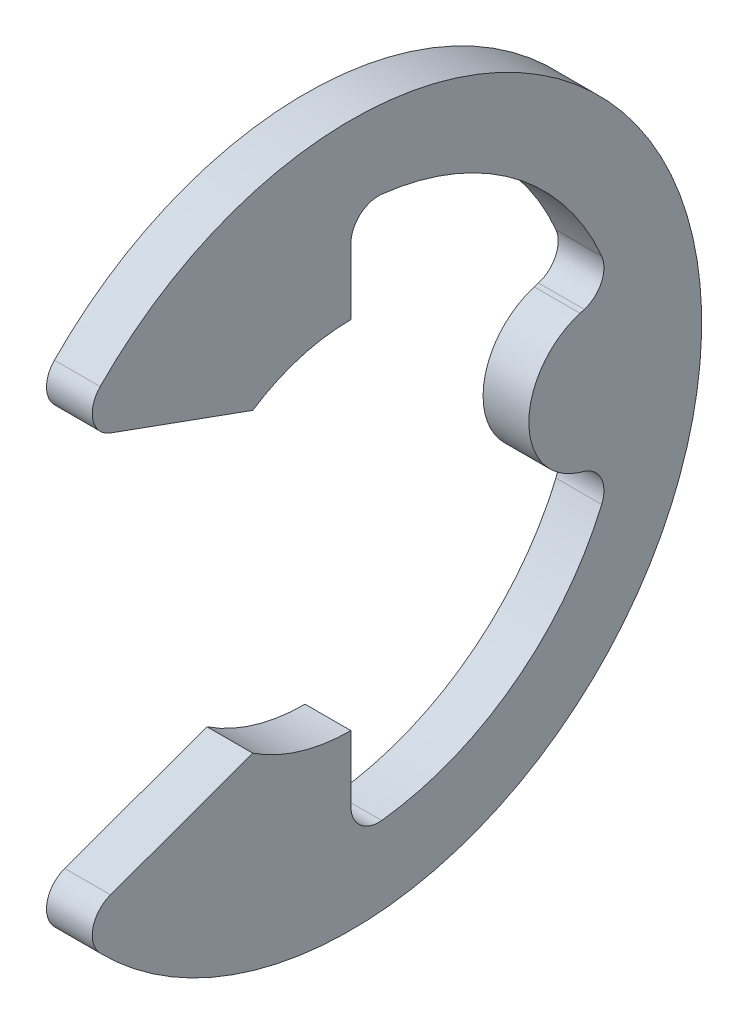
ISO-10303-21;
HEADER;
FILE_DESCRIPTION(('STEP AP214'),'2;1');
FILE_NAME('part.step','',(''),(''),'','','');
FILE_SCHEMA(('AUTOMOTIVE_DESIGN { 1 0 10303 214 1 1 1 1 }'));
ENDSEC;
DATA;
#1=APPLICATION_CONTEXT('core data for automotive mechanical design processes');
#2=APPLICATION_PROTOCOL_DEFINITION('international standard','automotive_design',2000,#1);
#3=PRODUCT_CONTEXT('',#1,'mechanical');
#4=PRODUCT('Part','Part','',(#3));
#5=PRODUCT_RELATED_PRODUCT_CATEGORY('part','',(#4));
#6=PRODUCT_DEFINITION_FORMATION('','',#4);
#7=PRODUCT_DEFINITION_CONTEXT('part definition',#1,'design');
#8=PRODUCT_DEFINITION('design','',#6,#7);
#9=PRODUCT_DEFINITION_SHAPE('','',#8);
#10=(LENGTH_UNIT() NAMED_UNIT(*) SI_UNIT(.MILLI.,.METRE.));
#11=(NAMED_UNIT(*) PLANE_ANGLE_UNIT() SI_UNIT($,.RADIAN.));
#12=(NAMED_UNIT(*) SI_UNIT($,.STERADIAN.) SOLID_ANGLE_UNIT());
#13=UNCERTAINTY_MEASURE_WITH_UNIT(LENGTH_MEASURE(1.E-05),#10,'distance_accuracy_value','');
#14=(GEOMETRIC_REPRESENTATION_CONTEXT(3) GLOBAL_UNCERTAINTY_ASSIGNED_CONTEXT((#13)) GLOBAL_UNIT_ASSIGNED_CONTEXT((#10,
#11,#12)) REPRESENTATION_CONTEXT('',''));
#15=CARTESIAN_POINT('',(0.,0.,0.));
#16=DIRECTION('',(0.,0.,1.));
#17=DIRECTION('',(1.,0.,0.));
#18=AXIS2_PLACEMENT_3D('',#15,#16,#17);
#19=CARTESIAN_POINT('',(0.432,-1.0838507650733,-3.8504669068883));
#20=CARTESIAN_POINT('',(0.408000000000001,-1.0838507650733,-3.8504669068883));
#21=CARTESIAN_POINT('',(0.383999999999999,-1.0838507650733,-3.8504669068883));
#22=CARTESIAN_POINT('',(0.120000000000007,-1.0838507650733,-3.8504669068883));
#23=CARTESIAN_POINT('',(-0.119999999999997,-1.0838507650733,-3.8504669068883));
#24=CARTESIAN_POINT('',(-0.384,-1.0838507650733,-3.8504669068883));
#25=CARTESIAN_POINT('',(-0.407999999999999,-1.0838507650733,-3.8504669068883));
#26=CARTESIAN_POINT('',(-0.432,-1.0838507650733,-3.8504669068883));
#27=CARTESIAN_POINT('',(0.432,-0.687854206099396,-2.53298418194946));
#28=CARTESIAN_POINT('',(0.408000000000001,-0.687854206099396,-2.53298418194946));
#29=CARTESIAN_POINT('',(0.383999999999999,-0.687854206099396,-2.53298418194946));
#30=CARTESIAN_POINT('',(0.120000000000007,-0.687854206099396,-2.53298418194946));
#31=CARTESIAN_POINT('',(-0.120000000000003,-0.687854206099396,-2.53298418194946));
#32=CARTESIAN_POINT('',(-0.384,-0.687854206099396,-2.53298418194946));
#33=CARTESIAN_POINT('',(-0.408,-0.687854206099396,-2.53298418194946));
#34=CARTESIAN_POINT('',(-0.432,-0.687854206099396,-2.53298418194946));
#35=CARTESIAN_POINT('',(0.432,0.687854340516284,-2.53298418194946));
#36=CARTESIAN_POINT('',(0.408000000000001,0.687854340516284,-2.53298418194946));
#37=CARTESIAN_POINT('',(0.383999999999999,0.687854340516284,-2.53298418194946));
#38=CARTESIAN_POINT('',(0.120000000000007,0.687854340516284,-2.53298418194946));
#39=CARTESIAN_POINT('',(-0.120000000000003,0.687854340516284,-2.53298418194946));
#40=CARTESIAN_POINT('',(-0.384,0.687854340516284,-2.53298418194946));
#41=CARTESIAN_POINT('',(-0.408,0.687854340516284,-2.53298418194946));
#42=CARTESIAN_POINT('',(-0.432,0.687854340516284,-2.53298418194946));
#43=CARTESIAN_POINT('',(0.432,1.08385089949019,-3.8504669068883));
#44=CARTESIAN_POINT('',(0.408000000000001,1.08385089949019,-3.8504669068883));
#45=CARTESIAN_POINT('',(0.383999999999999,1.08385089949019,-3.8504669068883));
#46=CARTESIAN_POINT('',(0.120000000000007,1.08385089949019,-3.8504669068883));
#47=CARTESIAN_POINT('',(-0.12000000000001,1.08385089949019,-3.8504669068883));
#48=CARTESIAN_POINT('',(-0.383999999999999,1.08385089949019,-3.8504669068883));
#49=CARTESIAN_POINT('',(-0.408,1.08385089949019,-3.8504669068883));
#50=CARTESIAN_POINT('',(-0.432,1.08385089949019,-3.8504669068883));
#51=(BOUNDED_SURFACE() B_SPLINE_SURFACE(3,3,((#19,#20,#21,#22,#23,#24,#25,#26),(#27,#28,#29,#30,
#31,#32,#33,#34),(#35,#36,#37,#38,#39,#40,#41,#42),(#43,#44,#45,#46,#47,#48,#49,#50)),
.UNSPECIFIED.,.F.,.F.,.F.) B_SPLINE_SURFACE_WITH_KNOTS((4,4),(4,2,2,4),(0.,1.),(-0.1,0.,1.,1.1),
.UNSPECIFIED.) GEOMETRIC_REPRESENTATION_ITEM() RATIONAL_B_SPLINE_SURFACE(((1.,1.,1.,1.,1.,1.,1.,
1.),(0.525232777901046,0.525232777901046,0.525232777901047,0.525232777901047,0.525232777901047,
0.525232777901047,0.525232777901046,0.525232777901046),(0.525232777901046,0.525232777901046,
0.525232777901047,0.525232777901047,0.525232777901047,0.525232777901047,0.525232777901046,
0.525232777901046),(1.,1.,1.,1.,1.,1.,1.,1.))) REPRESENTATION_ITEM('') SURFACE());
#52=CARTESIAN_POINT('',(0.432,1.08385089949019,-3.8504669068883));
#53=CARTESIAN_POINT('',(0.408000000000001,1.08385089949019,-3.8504669068883));
#54=CARTESIAN_POINT('',(0.383999999999999,1.08385089949019,-3.8504669068883));
#55=CARTESIAN_POINT('',(0.120000000000007,1.08385089949019,-3.8504669068883));
#56=CARTESIAN_POINT('',(-0.12000000000001,1.08385089949019,-3.8504669068883));
#57=CARTESIAN_POINT('',(-0.383999999999999,1.08385089949019,-3.8504669068883));
#58=CARTESIAN_POINT('',(-0.408,1.08385089949019,-3.8504669068883));
#59=CARTESIAN_POINT('',(-0.432,1.08385089949019,-3.8504669068883));
#60=(BOUNDED_CURVE() B_SPLINE_CURVE(3,(#52,#53,#54,#55,#56,#57,#58,#59),.UNSPECIFIED.,.F.,
.F.) B_SPLINE_CURVE_WITH_KNOTS((4,2,2,4),(-0.1,0.,1.,1.1),
.UNSPECIFIED.) CURVE() GEOMETRIC_REPRESENTATION_ITEM() RATIONAL_B_SPLINE_CURVE((1.,1.,1.,1.,1.,
1.,1.,1.)) REPRESENTATION_ITEM(''));
#61=CARTESIAN_POINT('',(-0.36,1.08385089949019,-3.8504669068883));
#62=VERTEX_POINT('',#61);
#63=CARTESIAN_POINT('',(0.36,1.08385089949019,-3.8504669068883));
#64=VERTEX_POINT('',#63);
#65=EDGE_CURVE('E198',#62,#64,#60,.F.);
#66=CARTESIAN_POINT('',(-0.36,1.08385089949019,-3.8504669068883));
#67=CARTESIAN_POINT('',(-0.36,0.687854340516284,-2.53298418194946));
#68=CARTESIAN_POINT('',(-0.36,-0.687854206099396,-2.53298418194946));
#69=CARTESIAN_POINT('',(-0.36,-1.0838507650733,-3.8504669068883));
#70=(BOUNDED_CURVE() B_SPLINE_CURVE(3,(#66,#67,#68,#69),.UNSPECIFIED.,.F.,
.F.) B_SPLINE_CURVE_WITH_KNOTS((4,4),(0.,1.),
.UNSPECIFIED.) CURVE() GEOMETRIC_REPRESENTATION_ITEM() RATIONAL_B_SPLINE_CURVE((1.,
0.525232777901047,0.525232777901047,1.)) REPRESENTATION_ITEM(''));
#71=CARTESIAN_POINT('',(-0.36,-1.0838507650733,-3.8504669068883));
#72=VERTEX_POINT('',#71);
#73=EDGE_CURVE('E460',#72,#62,#70,.F.);
#74=CARTESIAN_POINT('',(-0.432,-1.0838507650733,-3.8504669068883));
#75=CARTESIAN_POINT('',(-0.407999999999999,-1.0838507650733,-3.8504669068883));
#76=CARTESIAN_POINT('',(-0.384,-1.0838507650733,-3.8504669068883));
#77=CARTESIAN_POINT('',(-0.119999999999997,-1.0838507650733,-3.8504669068883));
#78=CARTESIAN_POINT('',(0.120000000000007,-1.0838507650733,-3.8504669068883));
#79=CARTESIAN_POINT('',(0.383999999999999,-1.0838507650733,-3.8504669068883));
#80=CARTESIAN_POINT('',(0.408000000000001,-1.0838507650733,-3.8504669068883));
#81=CARTESIAN_POINT('',(0.432,-1.0838507650733,-3.8504669068883));
#82=(BOUNDED_CURVE() B_SPLINE_CURVE(3,(#74,#75,#76,#77,#78,#79,#80,#81),.UNSPECIFIED.,.F.,
.F.) B_SPLINE_CURVE_WITH_KNOTS((4,2,2,4),(-0.1,0.,1.,1.1),
.UNSPECIFIED.) CURVE() GEOMETRIC_REPRESENTATION_ITEM() RATIONAL_B_SPLINE_CURVE((1.,1.,1.,1.,1.,
1.,1.,1.)) REPRESENTATION_ITEM(''));
#83=CARTESIAN_POINT('',(0.36,-1.0838507650733,-3.8504669068883));
#84=VERTEX_POINT('',#83);
#85=EDGE_CURVE('E331',#84,#72,#82,.F.);
#86=CARTESIAN_POINT('',(0.36,-1.0838507650733,-3.8504669068883));
#87=CARTESIAN_POINT('',(0.36,-0.687854206099396,-2.53298418194946));
#88=CARTESIAN_POINT('',(0.36,0.687854340516284,-2.53298418194946));
#89=CARTESIAN_POINT('',(0.36,1.08385089949019,-3.8504669068883));
#90=(BOUNDED_CURVE() B_SPLINE_CURVE(3,(#86,#87,#88,#89),.UNSPECIFIED.,.F.,
.F.) B_SPLINE_CURVE_WITH_KNOTS((4,4),(0.,1.),
.UNSPECIFIED.) CURVE() GEOMETRIC_REPRESENTATION_ITEM() RATIONAL_B_SPLINE_CURVE((1.,
0.525232777901047,0.525232777901047,1.)) REPRESENTATION_ITEM(''));
#91=EDGE_CURVE('E405',#64,#84,#90,.F.);
#92=ORIENTED_EDGE('',*,*,#65,.F.);
#93=ORIENTED_EDGE('',*,*,#73,.F.);
#94=ORIENTED_EDGE('',*,*,#85,.F.);
#95=ORIENTED_EDGE('',*,*,#91,.F.);
#96=EDGE_LOOP('',(#92,#93,#94,#95));
#97=FACE_BOUND('',#96,.T.);
#98=ADVANCED_FACE('F51',(#97),#51,.T.);
#99=CARTESIAN_POINT('',(0.36,6.72084442246652E-08,-0.244489239703902));
#100=DIRECTION('',(-1.,0.,0.));
#101=DIRECTION('',(0.,0.,1.));
#102=AXIS2_PLACEMENT_3D('',#99,#100,#101);
#103=CYLINDRICAL_SURFACE('',#102,5.52);
#104=CARTESIAN_POINT('',(0.36,6.72084442246652E-08,-0.244489239703902));
#105=DIRECTION('',(1.,0.,0.));
#106=DIRECTION('',(0.,0.,-1.));
#107=AXIS2_PLACEMENT_3D('',#104,#105,#106);
#108=CIRCLE('',#107,5.52);
#109=CARTESIAN_POINT('',(0.36,-3.86033621487492,3.70116707949457));
#110=VERTEX_POINT('',#109);
#111=CARTESIAN_POINT('',(0.36,3.86033634929181,3.70116707949457));
#112=VERTEX_POINT('',#111);
#113=EDGE_CURVE('E188',#110,#112,#108,.T.);
#114=ORIENTED_EDGE('',*,*,#113,.F.);
#115=DIRECTION('',(-1.,0.,0.));
#116=VECTOR('',#115,1.);
#117=CARTESIAN_POINT('',(0.36,-3.86033621487492,3.70116707949457));
#118=LINE('',#117,#116);
#119=CARTESIAN_POINT('',(-0.36,-3.86033621487492,3.70116707949457));
#120=VERTEX_POINT('',#119);
#121=EDGE_CURVE('E301',#110,#120,#118,.T.);
#122=ORIENTED_EDGE('',*,*,#121,.T.);
#123=CARTESIAN_POINT('',(-0.36,6.72084442246652E-08,-0.244489239703902));
#124=DIRECTION('',(1.,0.,0.));
#125=DIRECTION('',(0.,0.,-1.));
#126=AXIS2_PLACEMENT_3D('',#123,#124,#125);
#127=CIRCLE('',#126,5.52);
#128=CARTESIAN_POINT('',(-0.36,3.86033634929181,3.70116707949457));
#129=VERTEX_POINT('',#128);
#130=EDGE_CURVE('E495',#120,#129,#127,.T.);
#131=ORIENTED_EDGE('',*,*,#130,.T.);
#132=DIRECTION('',(-1.,0.,0.));
#133=VECTOR('',#132,1.);
#134=CARTESIAN_POINT('',(0.36,3.86033634929181,3.70116707949457));
#135=LINE('',#134,#133);
#136=EDGE_CURVE('E298',#129,#112,#135,.F.);
#137=ORIENTED_EDGE('',*,*,#136,.T.);
#138=EDGE_LOOP('',(#114,#122,#131,#137));
#139=FACE_BOUND('',#138,.T.);
#140=ADVANCED_FACE('F364',(#139),#103,.T.);
#141=CARTESIAN_POINT('',(0.36,3.36227775508424,4.13335140947608));
#142=DIRECTION('',(0.,0.940251578674077,-0.340480496946456));
#143=DIRECTION('',(0.,0.340480496946456,0.940251578674077));
#144=AXIS2_PLACEMENT_3D('',#141,#142,#143);
#145=PLANE('',#144);
#146=DIRECTION('',(0.,-0.340480496946456,-0.940251578674077));
#147=VECTOR('',#146,1.);
#148=CARTESIAN_POINT('',(0.36,3.36227775508424,4.13335140947608));
#149=LINE('',#148,#147);
#150=CARTESIAN_POINT('',(0.36,3.14678771189729,3.53826636022306));
#151=VERTEX_POINT('',#150);
#152=CARTESIAN_POINT('',(0.36,2.33600006720844,1.29924130673223));
#153=VERTEX_POINT('',#152);
#154=EDGE_CURVE('E176',#151,#153,#149,.T.);
#155=ORIENTED_EDGE('',*,*,#154,.F.);
#156=DIRECTION('',(-1.,0.,0.));
#157=VECTOR('',#156,1.);
#158=CARTESIAN_POINT('',(0.36,3.14678771189729,3.53826636022306));
#159=LINE('',#158,#157);
#160=CARTESIAN_POINT('',(-0.36,3.14678771189729,3.53826636022306));
#161=VERTEX_POINT('',#160);
#162=EDGE_CURVE('E233',#151,#161,#159,.T.);
#163=ORIENTED_EDGE('',*,*,#162,.T.);
#164=DIRECTION('',(0.,-0.340480496946456,-0.940251578674077));
#165=VECTOR('',#164,1.);
#166=CARTESIAN_POINT('',(-0.36,3.36227775508424,4.13335140947608));
#167=LINE('',#166,#165);
#168=CARTESIAN_POINT('',(-0.36,2.33600006720844,1.29924130673223));
#169=VERTEX_POINT('',#168);
#170=EDGE_CURVE('E194',#161,#169,#167,.T.);
#171=ORIENTED_EDGE('',*,*,#170,.T.);
#172=DIRECTION('',(-1.,0.,0.));
#173=VECTOR('',#172,1.);
#174=CARTESIAN_POINT('',(0.36,2.33600006720844,1.29924130673223));
#175=LINE('',#174,#173);
#176=EDGE_CURVE('E191',#153,#169,#175,.T.);
#177=ORIENTED_EDGE('',*,*,#176,.F.);
#178=EDGE_LOOP('',(#155,#163,#171,#177));
#179=FACE_BOUND('',#178,.T.);
#180=ADVANCED_FACE('F192',(#179),#145,.F.);
#181=CARTESIAN_POINT('',(0.36,6.72084442246652E-08,-0.244489239703902));
#182=DIRECTION('',(-1.,0.,0.));
#183=DIRECTION('',(0.,0.,1.));
#184=AXIS2_PLACEMENT_3D('',#181,#182,#183);
#185=CYLINDRICAL_SURFACE('',#184,2.8);
#186=CARTESIAN_POINT('',(-0.36,6.72084442246652E-08,-0.244489239703902));
#187=DIRECTION('',(-1.,0.,0.));
#188=DIRECTION('',(0.,0.,1.));
#189=AXIS2_PLACEMENT_3D('',#186,#187,#188);
#190=CIRCLE('',#189,2.8);
#191=CARTESIAN_POINT('',(-0.36,2.80000006720844,-0.244489239703902));
#192=VERTEX_POINT('',#191);
#193=EDGE_CURVE('E501',#169,#192,#190,.T.);
#194=ORIENTED_EDGE('',*,*,#193,.T.);
#195=DIRECTION('',(-1.,0.,0.));
#196=VECTOR('',#195,1.);
#197=CARTESIAN_POINT('',(0.36,2.80000006720844,-0.244489239703902));
#198=LINE('',#197,#196);
#199=CARTESIAN_POINT('',(0.36,2.80000006720844,-0.244489239703902));
#200=VERTEX_POINT('',#199);
#201=EDGE_CURVE('E199',#200,#192,#198,.T.);
#202=ORIENTED_EDGE('',*,*,#201,.F.);
#203=CARTESIAN_POINT('',(0.36,6.72084442246652E-08,-0.244489239703902));
#204=DIRECTION('',(-1.,0.,0.));
#205=DIRECTION('',(0.,0.,1.));
#206=AXIS2_PLACEMENT_3D('',#203,#204,#205);
#207=CIRCLE('',#206,2.8);
#208=EDGE_CURVE('E182',#153,#200,#207,.T.);
#209=ORIENTED_EDGE('',*,*,#208,.F.);
#210=ORIENTED_EDGE('',*,*,#176,.T.);
#211=EDGE_LOOP('',(#194,#202,#209,#210));
#212=FACE_BOUND('',#211,.T.);
#213=ADVANCED_FACE('F201',(#212),#185,.F.);
#214=CARTESIAN_POINT('',(0.36,2.80000006720844,-0.244489239703902));
#215=DIRECTION('',(0.,0.,1.));
#216=DIRECTION('',(0.,-1.,0.));
#217=AXIS2_PLACEMENT_3D('',#214,#215,#216);
#218=PLANE('',#217);
#219=DIRECTION('',(0.,1.,0.));
#220=VECTOR('',#219,1.);
#221=CARTESIAN_POINT('',(-0.36,2.80000006720844,-0.244489239703902));
#222=LINE('',#221,#220);
#223=CARTESIAN_POINT('',(-0.36,3.83437513578132,-0.244489239703901));
#224=VERTEX_POINT('',#223);
#225=EDGE_CURVE('E281',#192,#224,#222,.T.);
#226=ORIENTED_EDGE('',*,*,#225,.T.);
#227=DIRECTION('',(1.,0.,0.));
#228=VECTOR('',#227,1.);
#229=CARTESIAN_POINT('',(0.36,3.83437513578132,-0.244489239703901));
#230=LINE('',#229,#228);
#231=CARTESIAN_POINT('',(0.36,3.83437513578132,-0.244489239703901));
#232=VERTEX_POINT('',#231);
#233=EDGE_CURVE('E290',#224,#232,#230,.T.);
#234=ORIENTED_EDGE('',*,*,#233,.T.);
#235=DIRECTION('',(0.,1.,0.));
#236=VECTOR('',#235,1.);
#237=CARTESIAN_POINT('',(0.36,2.80000006720844,-0.244489239703902));
#238=LINE('',#237,#236);
#239=EDGE_CURVE('E205',#200,#232,#238,.T.);
#240=ORIENTED_EDGE('',*,*,#239,.F.);
#241=ORIENTED_EDGE('',*,*,#201,.T.);
#242=EDGE_LOOP('',(#226,#234,#240,#241));
#243=FACE_BOUND('',#242,.T.);
#244=ADVANCED_FACE('F356',(#243),#218,.F.);
#245=CARTESIAN_POINT('',(0.36,6.72084442246652E-08,-0.244489239703902));
#246=DIRECTION('',(-1.,0.,0.));
#247=DIRECTION('',(0.,0.,1.));
#248=AXIS2_PLACEMENT_3D('',#245,#246,#247);
#249=CYLINDRICAL_SURFACE('',#248,4.2941935483871);
#250=CARTESIAN_POINT('',(0.36,6.72084442246652E-08,-0.244489239703902));
#251=DIRECTION('',(-1.,0.,0.));
#252=DIRECTION('',(0.,0.,-1.));
#253=AXIS2_PLACEMENT_3D('',#250,#251,#252);
#254=CIRCLE('',#253,4.2941935483871);
#255=CARTESIAN_POINT('',(0.36,4.26679877394479,-0.728769145545973));
#256=VERTEX_POINT('',#255);
#257=CARTESIAN_POINT('',(0.36,1.69197764589692,-4.19129935728301));
#258=VERTEX_POINT('',#257);
#259=EDGE_CURVE('E209',#256,#258,#254,.T.);
#260=ORIENTED_EDGE('',*,*,#259,.F.);
#261=DIRECTION('',(-1.,0.,0.));
#262=VECTOR('',#261,1.);
#263=CARTESIAN_POINT('',(0.36,4.26679877394479,-0.728769145545973));
#264=LINE('',#263,#262);
#265=CARTESIAN_POINT('',(-0.36,4.26679877394479,-0.728769145545973));
#266=VERTEX_POINT('',#265);
#267=EDGE_CURVE('E279',#256,#266,#264,.T.);
#268=ORIENTED_EDGE('',*,*,#267,.T.);
#269=CARTESIAN_POINT('',(-0.36,6.72084442246652E-08,-0.244489239703902));
#270=DIRECTION('',(-1.,0.,0.));
#271=DIRECTION('',(0.,0.,-1.));
#272=AXIS2_PLACEMENT_3D('',#269,#270,#271);
#273=CIRCLE('',#272,4.2941935483871);
#274=CARTESIAN_POINT('',(-0.36,1.69197764589692,-4.19129935728301));
#275=VERTEX_POINT('',#274);
#276=EDGE_CURVE('E267',#266,#275,#273,.T.);
#277=ORIENTED_EDGE('',*,*,#276,.T.);
#278=DIRECTION('',(-1.,0.,0.));
#279=VECTOR('',#278,1.);
#280=CARTESIAN_POINT('',(0.36,1.69197764589692,-4.19129935728301));
#281=LINE('',#280,#279);
#282=EDGE_CURVE('E277',#275,#258,#281,.F.);
#283=ORIENTED_EDGE('',*,*,#282,.T.);
#284=EDGE_LOOP('',(#260,#268,#277,#283));
#285=FACE_BOUND('',#284,.T.);
#286=ADVANCED_FACE('F276',(#285),#249,.F.);
#287=CARTESIAN_POINT('',(0.36,0.80597773439284,-2.925981361639));
#288=DIRECTION('',(0.,-0.957675757833964,-0.28784916685157));
#289=DIRECTION('',(0.,0.28784916685157,-0.957675757833964));
#290=AXIS2_PLACEMENT_3D('',#287,#288,#289);
#291=PLANE('',#290);
#292=DIRECTION('',(0.,-0.28784916685157,0.957675757833964));
#293=VECTOR('',#292,1.);
#294=CARTESIAN_POINT('',(0.36,0.80597773439284,-2.925981361639));
#295=LINE('',#294,#293);
#296=CARTESIAN_POINT('',(0.36,1.10372173609358,-3.91657728931909));
#297=VERTEX_POINT('',#296);
#298=EDGE_CURVE('E216',#297,#64,#295,.T.);
#299=ORIENTED_EDGE('',*,*,#298,.F.);
#300=DIRECTION('',(1.,0.,0.));
#301=VECTOR('',#300,1.);
#302=CARTESIAN_POINT('',(-0.36,1.10372173609358,-3.91657728931909));
#303=LINE('',#302,#301);
#304=CARTESIAN_POINT('',(-0.36,1.10372173609358,-3.91657728931909));
#305=VERTEX_POINT('',#304);
#306=EDGE_CURVE('E238',#297,#305,#303,.F.);
#307=ORIENTED_EDGE('',*,*,#306,.T.);
#308=DIRECTION('',(0.,-0.28784916685157,0.957675757833964));
#309=VECTOR('',#308,1.);
#310=CARTESIAN_POINT('',(-0.36,0.80597773439284,-2.925981361639));
#311=LINE('',#310,#309);
#312=EDGE_CURVE('E269',#305,#62,#311,.T.);
#313=ORIENTED_EDGE('',*,*,#312,.T.);
#314=ORIENTED_EDGE('',*,*,#65,.T.);
#315=EDGE_LOOP('',(#299,#307,#313,#314));
#316=FACE_BOUND('',#315,.T.);
#317=ADVANCED_FACE('F348',(#316),#291,.F.);
#318=CARTESIAN_POINT('',(0.36,-0.805977599975951,-2.925981361639));
#319=DIRECTION('',(0.,0.957675757833964,-0.28784916685157));
#320=DIRECTION('',(0.,0.28784916685157,0.957675757833964));
#321=AXIS2_PLACEMENT_3D('',#318,#319,#320);
#322=PLANE('',#321);
#323=DIRECTION('',(0.,-0.28784916685157,-0.957675757833964));
#324=VECTOR('',#323,1.);
#325=CARTESIAN_POINT('',(-0.36,-0.805977599975951,-2.925981361639));
#326=LINE('',#325,#324);
#327=CARTESIAN_POINT('',(-0.36,-1.10372160167669,-3.91657728931909));
#328=VERTEX_POINT('',#327);
#329=EDGE_CURVE('E309',#72,#328,#326,.T.);
#330=ORIENTED_EDGE('',*,*,#329,.T.);
#331=DIRECTION('',(1.,0.,0.));
#332=VECTOR('',#331,1.);
#333=CARTESIAN_POINT('',(0.36,-1.10372160167669,-3.91657728931909));
#334=LINE('',#333,#332);
#335=CARTESIAN_POINT('',(0.36,-1.10372160167669,-3.91657728931909));
#336=VERTEX_POINT('',#335);
#337=EDGE_CURVE('E75',#328,#336,#334,.T.);
#338=ORIENTED_EDGE('',*,*,#337,.T.);
#339=DIRECTION('',(0.,-0.28784916685157,-0.957675757833964));
#340=VECTOR('',#339,1.);
#341=CARTESIAN_POINT('',(0.36,-0.805977599975951,-2.925981361639));
#342=LINE('',#341,#340);
#343=EDGE_CURVE('E225',#84,#336,#342,.T.);
#344=ORIENTED_EDGE('',*,*,#343,.F.);
#345=ORIENTED_EDGE('',*,*,#85,.T.);
#346=EDGE_LOOP('',(#330,#338,#344,#345));
#347=FACE_BOUND('',#346,.T.);
#348=ADVANCED_FACE('F338',(#347),#322,.F.);
#349=CARTESIAN_POINT('',(0.36,6.72084442246652E-08,-0.244489239703902));
#350=DIRECTION('',(-1.,0.,0.));
#351=DIRECTION('',(0.,0.,1.));
#352=AXIS2_PLACEMENT_3D('',#349,#350,#351);
#353=CYLINDRICAL_SURFACE('',#352,4.2941935483871);
#354=CARTESIAN_POINT('',(-0.36,6.72084442246652E-08,-0.244489239703902));
#355=DIRECTION('',(-1.,0.,0.));
#356=DIRECTION('',(0.,0.,-1.));
#357=AXIS2_PLACEMENT_3D('',#354,#355,#356);
#358=CIRCLE('',#357,4.2941935483871);
#359=CARTESIAN_POINT('',(-0.36,-1.69197751148003,-4.19129935728301));
#360=VERTEX_POINT('',#359);
#361=CARTESIAN_POINT('',(-0.36,-4.2667986395279,-0.728769145545974));
#362=VERTEX_POINT('',#361);
#363=EDGE_CURVE('E315',#360,#362,#358,.T.);
#364=ORIENTED_EDGE('',*,*,#363,.T.);
#365=DIRECTION('',(-1.,0.,0.));
#366=VECTOR('',#365,1.);
#367=CARTESIAN_POINT('',(0.36,-4.2667986395279,-0.728769145545974));
#368=LINE('',#367,#366);
#369=CARTESIAN_POINT('',(0.36,-4.2667986395279,-0.728769145545974));
#370=VERTEX_POINT('',#369);
#371=EDGE_CURVE('E285',#362,#370,#368,.F.);
#372=ORIENTED_EDGE('',*,*,#371,.T.);
#373=CARTESIAN_POINT('',(0.36,6.72084442246652E-08,-0.244489239703902));
#374=DIRECTION('',(-1.,0.,0.));
#375=DIRECTION('',(0.,0.,-1.));
#376=AXIS2_PLACEMENT_3D('',#373,#374,#375);
#377=CIRCLE('',#376,4.2941935483871);
#378=CARTESIAN_POINT('',(0.36,-1.69197751148003,-4.19129935728301));
#379=VERTEX_POINT('',#378);
#380=EDGE_CURVE('E327',#379,#370,#377,.T.);
#381=ORIENTED_EDGE('',*,*,#380,.F.);
#382=DIRECTION('',(-1.,0.,0.));
#383=VECTOR('',#382,1.);
#384=CARTESIAN_POINT('',(0.36,-1.69197751148003,-4.19129935728301));
#385=LINE('',#384,#383);
#386=EDGE_CURVE('E292',#379,#360,#385,.T.);
#387=ORIENTED_EDGE('',*,*,#386,.T.);
#388=EDGE_LOOP('',(#364,#372,#381,#387));
#389=FACE_BOUND('',#388,.T.);
#390=ADVANCED_FACE('F347',(#389),#353,.F.);
#391=CARTESIAN_POINT('',(0.36,-2.79999993279156,-0.244489239703902));
#392=DIRECTION('',(0.,0.,1.));
#393=DIRECTION('',(0.,-1.,0.));
#394=AXIS2_PLACEMENT_3D('',#391,#392,#393);
#395=PLANE('',#394);
#396=DIRECTION('',(0.,1.,0.));
#397=VECTOR('',#396,1.);
#398=CARTESIAN_POINT('',(0.36,-2.79999993279156,-0.244489239703902));
#399=LINE('',#398,#397);
#400=CARTESIAN_POINT('',(0.36,-3.83437500136443,-0.244489239703902));
#401=VERTEX_POINT('',#400);
#402=CARTESIAN_POINT('',(0.36,-2.79999993279156,-0.244489239703902));
#403=VERTEX_POINT('',#402);
#404=EDGE_CURVE('E472',#401,#403,#399,.T.);
#405=ORIENTED_EDGE('',*,*,#404,.F.);
#406=DIRECTION('',(1.,0.,0.));
#407=VECTOR('',#406,1.);
#408=CARTESIAN_POINT('',(-0.36,-3.83437500136443,-0.244489239703902));
#409=LINE('',#408,#407);
#410=CARTESIAN_POINT('',(-0.36,-3.83437500136443,-0.244489239703902));
#411=VERTEX_POINT('',#410);
#412=EDGE_CURVE('E410',#401,#411,#409,.F.);
#413=ORIENTED_EDGE('',*,*,#412,.T.);
#414=DIRECTION('',(0.,1.,0.));
#415=VECTOR('',#414,1.);
#416=CARTESIAN_POINT('',(-0.36,-2.79999993279156,-0.244489239703902));
#417=LINE('',#416,#415);
#418=CARTESIAN_POINT('',(-0.36,-2.79999993279156,-0.244489239703902));
#419=VERTEX_POINT('',#418);
#420=EDGE_CURVE('E432',#411,#419,#417,.T.);
#421=ORIENTED_EDGE('',*,*,#420,.T.);
#422=DIRECTION('',(-1.,0.,0.));
#423=VECTOR('',#422,1.);
#424=CARTESIAN_POINT('',(0.36,-2.79999993279156,-0.244489239703902));
#425=LINE('',#424,#423);
#426=EDGE_CURVE('E451',#403,#419,#425,.T.);
#427=ORIENTED_EDGE('',*,*,#426,.F.);
#428=EDGE_LOOP('',(#405,#413,#421,#427));
#429=FACE_BOUND('',#428,.T.);
#430=ADVANCED_FACE('F475',(#429),#395,.F.);
#431=CARTESIAN_POINT('',(0.36,6.72084442246652E-08,-0.244489239703902));
#432=DIRECTION('',(-1.,0.,0.));
#433=DIRECTION('',(0.,0.,1.));
#434=AXIS2_PLACEMENT_3D('',#431,#432,#433);
#435=CYLINDRICAL_SURFACE('',#434,2.8);
#436=CARTESIAN_POINT('',(-0.36,6.72084442246652E-08,-0.244489239703902));
#437=DIRECTION('',(-1.,0.,0.));
#438=DIRECTION('',(0.,0.,-1.));
#439=AXIS2_PLACEMENT_3D('',#436,#437,#438);
#440=CIRCLE('',#439,2.8);
#441=CARTESIAN_POINT('',(-0.36,-2.33599993279156,1.29924130673223));
#442=VERTEX_POINT('',#441);
#443=EDGE_CURVE('E435',#419,#442,#440,.T.);
#444=ORIENTED_EDGE('',*,*,#443,.T.);
#445=DIRECTION('',(-1.,0.,0.));
#446=VECTOR('',#445,1.);
#447=CARTESIAN_POINT('',(0.36,-2.33599993279156,1.29924130673223));
#448=LINE('',#447,#446);
#449=CARTESIAN_POINT('',(0.36,-2.33599993279156,1.29924130673223));
#450=VERTEX_POINT('',#449);
#451=EDGE_CURVE('E447',#450,#442,#448,.T.);
#452=ORIENTED_EDGE('',*,*,#451,.F.);
#453=CARTESIAN_POINT('',(0.36,6.72084442246652E-08,-0.244489239703902));
#454=DIRECTION('',(-1.,0.,0.));
#455=DIRECTION('',(0.,0.,-1.));
#456=AXIS2_PLACEMENT_3D('',#453,#454,#455);
#457=CIRCLE('',#456,2.8);
#458=EDGE_CURVE('E488',#403,#450,#457,.T.);
#459=ORIENTED_EDGE('',*,*,#458,.F.);
#460=ORIENTED_EDGE('',*,*,#426,.T.);
#461=EDGE_LOOP('',(#444,#452,#459,#460));
#462=FACE_BOUND('',#461,.T.);
#463=ADVANCED_FACE('F480',(#462),#435,.F.);
#464=CARTESIAN_POINT('',(0.36,-3.36227762066735,4.13335140947608));
#465=DIRECTION('',(0.,-0.940251578674077,-0.340480496946456));
#466=DIRECTION('',(0.,0.340480496946456,-0.940251578674077));
#467=AXIS2_PLACEMENT_3D('',#464,#465,#466);
#468=PLANE('',#467);
#469=DIRECTION('',(0.,-0.340480496946456,0.940251578674077));
#470=VECTOR('',#469,1.);
#471=CARTESIAN_POINT('',(-0.36,-3.36227762066735,4.13335140947608));
#472=LINE('',#471,#470);
#473=CARTESIAN_POINT('',(-0.36,-3.1467875774804,3.53826636022306));
#474=VERTEX_POINT('',#473);
#475=EDGE_CURVE('E441',#442,#474,#472,.T.);
#476=ORIENTED_EDGE('',*,*,#475,.T.);
#477=DIRECTION('',(-1.,0.,0.));
#478=VECTOR('',#477,1.);
#479=CARTESIAN_POINT('',(0.36,-3.1467875774804,3.53826636022306));
#480=LINE('',#479,#478);
#481=CARTESIAN_POINT('',(0.36,-3.1467875774804,3.53826636022306));
#482=VERTEX_POINT('',#481);
#483=EDGE_CURVE('E226',#474,#482,#480,.F.);
#484=ORIENTED_EDGE('',*,*,#483,.T.);
#485=DIRECTION('',(0.,-0.340480496946456,0.940251578674077));
#486=VECTOR('',#485,1.);
#487=CARTESIAN_POINT('',(0.36,-3.36227762066735,4.13335140947608));
#488=LINE('',#487,#486);
#489=EDGE_CURVE('E452',#450,#482,#488,.T.);
#490=ORIENTED_EDGE('',*,*,#489,.F.);
#491=ORIENTED_EDGE('',*,*,#451,.T.);
#492=EDGE_LOOP('',(#476,#484,#490,#491));
#493=FACE_BOUND('',#492,.T.);
#494=ADVANCED_FACE('F484',(#493),#468,.F.);
#495=CARTESIAN_POINT('',(0.36,6.72084442246652E-08,-0.244489239703902));
#496=DIRECTION('',(1.,0.,0.));
#497=DIRECTION('',(0.,0.,-1.));
#498=AXIS2_PLACEMENT_3D('',#495,#496,#497);
#499=PLANE('',#498);
#500=ORIENTED_EDGE('',*,*,#489,.T.);
#501=CARTESIAN_POINT('',(0.36,-3.55598506451936,3.39008924795196));
#502=DIRECTION('',(1.,0.,0.));
#503=DIRECTION('',(0.,0.,-1.));
#504=AXIS2_PLACEMENT_3D('',#501,#502,#503);
#505=CIRCLE('',#504,0.4352);
#506=EDGE_CURVE('E230',#482,#110,#505,.T.);
#507=ORIENTED_EDGE('',*,*,#506,.T.);
#508=ORIENTED_EDGE('',*,*,#113,.T.);
#509=CARTESIAN_POINT('',(0.36,3.55598519893625,3.39008924795196));
#510=DIRECTION('',(1.,0.,0.));
#511=DIRECTION('',(0.,0.,-1.));
#512=AXIS2_PLACEMENT_3D('',#509,#510,#511);
#513=CIRCLE('',#512,0.4352);
#514=EDGE_CURVE('E67',#112,#151,#513,.T.);
#515=ORIENTED_EDGE('',*,*,#514,.T.);
#516=ORIENTED_EDGE('',*,*,#154,.T.);
#517=ORIENTED_EDGE('',*,*,#208,.T.);
#518=ORIENTED_EDGE('',*,*,#239,.T.);
#519=CARTESIAN_POINT('',(0.36,3.83437513578132,-0.679689239703902));
#520=DIRECTION('',(1.,0.,0.));
#521=DIRECTION('',(0.,0.,-1.));
#522=AXIS2_PLACEMENT_3D('',#519,#520,#521);
#523=CIRCLE('',#522,0.4352);
#524=EDGE_CURVE('E251',#232,#256,#523,.F.);
#525=ORIENTED_EDGE('',*,*,#524,.T.);
#526=ORIENTED_EDGE('',*,*,#259,.T.);
#527=CARTESIAN_POINT('',(0.36,1.52050222590292,-3.79130533190528));
#528=DIRECTION('',(1.,0.,0.));
#529=DIRECTION('',(0.,0.,-1.));
#530=AXIS2_PLACEMENT_3D('',#527,#528,#529);
#531=CIRCLE('',#530,0.4352);
#532=EDGE_CURVE('E12',#258,#297,#531,.F.);
#533=ORIENTED_EDGE('',*,*,#532,.T.);
#534=ORIENTED_EDGE('',*,*,#298,.T.);
#535=ORIENTED_EDGE('',*,*,#91,.T.);
#536=ORIENTED_EDGE('',*,*,#343,.T.);
#537=CARTESIAN_POINT('',(0.36,-1.52050209148603,-3.79130533190529));
#538=DIRECTION('',(1.,0.,0.));
#539=DIRECTION('',(0.,0.,-1.));
#540=AXIS2_PLACEMENT_3D('',#537,#538,#539);
#541=CIRCLE('',#540,0.4352);
#542=EDGE_CURVE('E257',#336,#379,#541,.F.);
#543=ORIENTED_EDGE('',*,*,#542,.T.);
#544=ORIENTED_EDGE('',*,*,#380,.T.);
#545=CARTESIAN_POINT('',(0.36,-3.83437500136443,-0.679689239703902));
#546=DIRECTION('',(1.,0.,0.));
#547=DIRECTION('',(0.,0.,-1.));
#548=AXIS2_PLACEMENT_3D('',#545,#546,#547);
#549=CIRCLE('',#548,0.4352);
#550=EDGE_CURVE('E245',#370,#401,#549,.F.);
#551=ORIENTED_EDGE('',*,*,#550,.T.);
#552=ORIENTED_EDGE('',*,*,#404,.T.);
#553=ORIENTED_EDGE('',*,*,#458,.T.);
#554=EDGE_LOOP('',(#500,#507,#508,#515,#516,#517,#518,#525,#526,#533,#534,#535,#536,#543,#544,
#551,#552,#553));
#555=FACE_BOUND('',#554,.T.);
#556=ADVANCED_FACE('F179',(#555),#499,.T.);
#557=CARTESIAN_POINT('',(-0.36,6.72084442246652E-08,-0.244489239703902));
#558=DIRECTION('',(1.,0.,0.));
#559=DIRECTION('',(0.,0.,-1.));
#560=AXIS2_PLACEMENT_3D('',#557,#558,#559);
#561=PLANE('',#560);
#562=ORIENTED_EDGE('',*,*,#130,.F.);
#563=CARTESIAN_POINT('',(-0.36,-3.55598506451936,3.39008924795196));
#564=DIRECTION('',(1.,0.,0.));
#565=DIRECTION('',(0.,0.,-1.));
#566=AXIS2_PLACEMENT_3D('',#563,#564,#565);
#567=CIRCLE('',#566,0.4352);
#568=EDGE_CURVE('E671',#120,#474,#567,.F.);
#569=ORIENTED_EDGE('',*,*,#568,.T.);
#570=ORIENTED_EDGE('',*,*,#475,.F.);
#571=ORIENTED_EDGE('',*,*,#443,.F.);
#572=ORIENTED_EDGE('',*,*,#420,.F.);
#573=CARTESIAN_POINT('',(-0.36,-3.83437500136443,-0.679689239703902));
#574=DIRECTION('',(1.,0.,0.));
#575=DIRECTION('',(0.,0.,-1.));
#576=AXIS2_PLACEMENT_3D('',#573,#574,#575);
#577=CIRCLE('',#576,0.4352);
#578=EDGE_CURVE('E242',#411,#362,#577,.T.);
#579=ORIENTED_EDGE('',*,*,#578,.T.);
#580=ORIENTED_EDGE('',*,*,#363,.F.);
#581=CARTESIAN_POINT('',(-0.36,-1.52050209148603,-3.79130533190529));
#582=DIRECTION('',(1.,0.,0.));
#583=DIRECTION('',(0.,0.,-1.));
#584=AXIS2_PLACEMENT_3D('',#581,#582,#583);
#585=CIRCLE('',#584,0.4352);
#586=EDGE_CURVE('E254',#360,#328,#585,.T.);
#587=ORIENTED_EDGE('',*,*,#586,.T.);
#588=ORIENTED_EDGE('',*,*,#329,.F.);
#589=ORIENTED_EDGE('',*,*,#73,.T.);
#590=ORIENTED_EDGE('',*,*,#312,.F.);
#591=CARTESIAN_POINT('',(-0.36,1.52050222590292,-3.79130533190528));
#592=DIRECTION('',(1.,0.,0.));
#593=DIRECTION('',(0.,0.,-1.));
#594=AXIS2_PLACEMENT_3D('',#591,#592,#593);
#595=CIRCLE('',#594,0.4352);
#596=EDGE_CURVE('E60',#305,#275,#595,.T.);
#597=ORIENTED_EDGE('',*,*,#596,.T.);
#598=ORIENTED_EDGE('',*,*,#276,.F.);
#599=CARTESIAN_POINT('',(-0.36,3.83437513578132,-0.679689239703902));
#600=DIRECTION('',(1.,0.,0.));
#601=DIRECTION('',(0.,0.,-1.));
#602=AXIS2_PLACEMENT_3D('',#599,#600,#601);
#603=CIRCLE('',#602,0.4352);
#604=EDGE_CURVE('E248',#266,#224,#603,.T.);
#605=ORIENTED_EDGE('',*,*,#604,.T.);
#606=ORIENTED_EDGE('',*,*,#225,.F.);
#607=ORIENTED_EDGE('',*,*,#193,.F.);
#608=ORIENTED_EDGE('',*,*,#170,.F.);
#609=CARTESIAN_POINT('',(-0.36,3.55598519893625,3.39008924795196));
#610=DIRECTION('',(1.,0.,0.));
#611=DIRECTION('',(0.,0.,-1.));
#612=AXIS2_PLACEMENT_3D('',#609,#610,#611);
#613=CIRCLE('',#612,0.4352);
#614=EDGE_CURVE('E305',#161,#129,#613,.F.);
#615=ORIENTED_EDGE('',*,*,#614,.T.);
#616=EDGE_LOOP('',(#562,#569,#570,#571,#572,#579,#580,#587,#588,#589,#590,#597,#598,#605,#606,
#607,#608,#615));
#617=FACE_BOUND('',#616,.T.);
#618=ADVANCED_FACE('F266',(#617),#561,.F.);
#619=CARTESIAN_POINT('',(0.36,-3.83437500136443,-0.679689239703902));
#620=DIRECTION('',(-1.,0.,0.));
#621=DIRECTION('',(0.,0.,1.));
#622=AXIS2_PLACEMENT_3D('',#619,#620,#621);
#623=CYLINDRICAL_SURFACE('',#622,0.4352);
#624=ORIENTED_EDGE('',*,*,#550,.F.);
#625=ORIENTED_EDGE('',*,*,#371,.F.);
#626=ORIENTED_EDGE('',*,*,#578,.F.);
#627=ORIENTED_EDGE('',*,*,#412,.F.);
#628=EDGE_LOOP('',(#624,#625,#626,#627));
#629=FACE_BOUND('',#628,.T.);
#630=ADVANCED_FACE('F374',(#629),#623,.F.);
#631=CARTESIAN_POINT('',(0.36,3.83437513578132,-0.679689239703902));
#632=DIRECTION('',(-1.,0.,0.));
#633=DIRECTION('',(0.,0.,1.));
#634=AXIS2_PLACEMENT_3D('',#631,#632,#633);
#635=CYLINDRICAL_SURFACE('',#634,0.4352);
#636=ORIENTED_EDGE('',*,*,#524,.F.);
#637=ORIENTED_EDGE('',*,*,#233,.F.);
#638=ORIENTED_EDGE('',*,*,#604,.F.);
#639=ORIENTED_EDGE('',*,*,#267,.F.);
#640=EDGE_LOOP('',(#636,#637,#638,#639));
#641=FACE_BOUND('',#640,.T.);
#642=ADVANCED_FACE('F510',(#641),#635,.F.);
#643=CARTESIAN_POINT('',(0.36,-3.55598506451936,3.39008924795196));
#644=DIRECTION('',(-1.,0.,0.));
#645=DIRECTION('',(0.,0.,1.));
#646=AXIS2_PLACEMENT_3D('',#643,#644,#645);
#647=CYLINDRICAL_SURFACE('',#646,0.4352);
#648=ORIENTED_EDGE('',*,*,#506,.F.);
#649=ORIENTED_EDGE('',*,*,#483,.F.);
#650=ORIENTED_EDGE('',*,*,#568,.F.);
#651=ORIENTED_EDGE('',*,*,#121,.F.);
#652=EDGE_LOOP('',(#648,#649,#650,#651));
#653=FACE_BOUND('',#652,.T.);
#654=ADVANCED_FACE('F512',(#653),#647,.T.);
#655=CARTESIAN_POINT('',(0.36,3.55598519893625,3.39008924795196));
#656=DIRECTION('',(-1.,0.,0.));
#657=DIRECTION('',(0.,0.,1.));
#658=AXIS2_PLACEMENT_3D('',#655,#656,#657);
#659=CYLINDRICAL_SURFACE('',#658,0.4352);
#660=ORIENTED_EDGE('',*,*,#514,.F.);
#661=ORIENTED_EDGE('',*,*,#136,.F.);
#662=ORIENTED_EDGE('',*,*,#614,.F.);
#663=ORIENTED_EDGE('',*,*,#162,.F.);
#664=EDGE_LOOP('',(#660,#661,#662,#663));
#665=FACE_BOUND('',#664,.T.);
#666=ADVANCED_FACE('F517',(#665),#659,.T.);
#667=CARTESIAN_POINT('',(0.36,-1.52050209148603,-3.79130533190529));
#668=DIRECTION('',(-1.,0.,0.));
#669=DIRECTION('',(0.,0.,1.));
#670=AXIS2_PLACEMENT_3D('',#667,#668,#669);
#671=CYLINDRICAL_SURFACE('',#670,0.4352);
#672=ORIENTED_EDGE('',*,*,#542,.F.);
#673=ORIENTED_EDGE('',*,*,#337,.F.);
#674=ORIENTED_EDGE('',*,*,#586,.F.);
#675=ORIENTED_EDGE('',*,*,#386,.F.);
#676=EDGE_LOOP('',(#672,#673,#674,#675));
#677=FACE_BOUND('',#676,.T.);
#678=ADVANCED_FACE('F468',(#677),#671,.F.);
#679=CARTESIAN_POINT('',(0.36,1.52050222590292,-3.79130533190528));
#680=DIRECTION('',(-1.,0.,0.));
#681=DIRECTION('',(0.,0.,1.));
#682=AXIS2_PLACEMENT_3D('',#679,#680,#681);
#683=CYLINDRICAL_SURFACE('',#682,0.4352);
#684=ORIENTED_EDGE('',*,*,#532,.F.);
#685=ORIENTED_EDGE('',*,*,#282,.F.);
#686=ORIENTED_EDGE('',*,*,#596,.F.);
#687=ORIENTED_EDGE('',*,*,#306,.F.);
#688=EDGE_LOOP('',(#684,#685,#686,#687));
#689=FACE_BOUND('',#688,.T.);
#690=ADVANCED_FACE('F53',(#689),#683,.F.);
#691=CLOSED_SHELL('',(#98,#140,#180,#213,#244,#286,#317,#348,#390,#430,#463,#494,#556,#618,#630,
#642,#654,#666,#678,#690));
#692=MANIFOLD_SOLID_BREP('B2',#691);
#693=ADVANCED_BREP_SHAPE_REPRESENTATION('',(#18,#692),#14);
#694=SHAPE_DEFINITION_REPRESENTATION(#9,#693);
ENDSEC;
END-ISO-10303-21;
